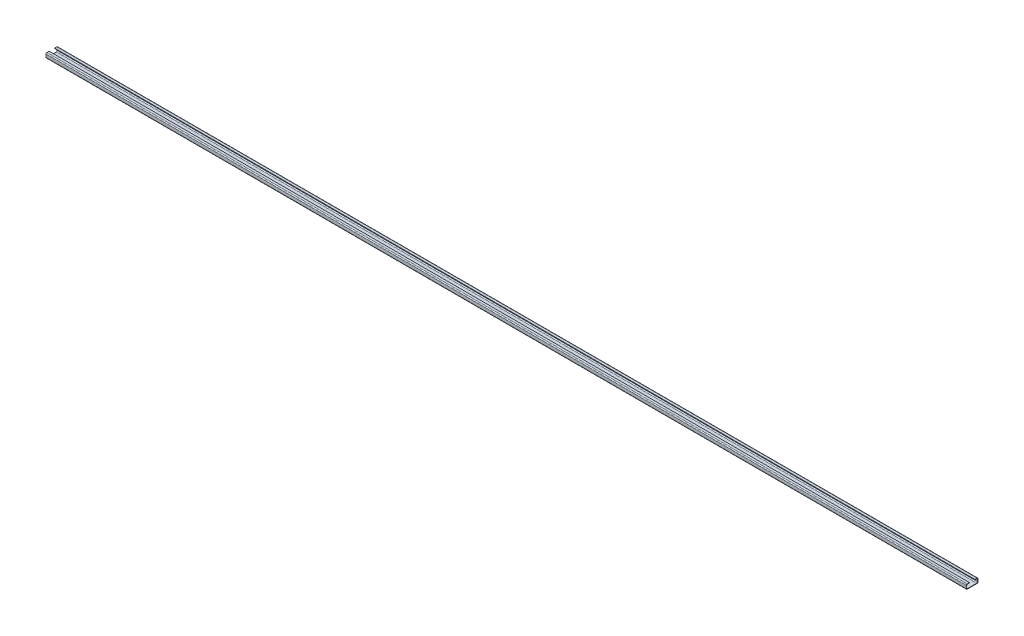
ISO-10303-21;
HEADER;
FILE_DESCRIPTION(('STEP AP214'),'2;1');
FILE_NAME('part.step','',(''),(''),'','','');
FILE_SCHEMA(('AUTOMOTIVE_DESIGN { 1 0 10303 214 1 1 1 1 }'));
ENDSEC;
DATA;
#1=APPLICATION_CONTEXT('core data for automotive mechanical design processes');
#2=APPLICATION_PROTOCOL_DEFINITION('international standard','automotive_design',2000,#1);
#3=PRODUCT_CONTEXT('',#1,'mechanical');
#4=PRODUCT('Part','Part','',(#3));
#5=PRODUCT_RELATED_PRODUCT_CATEGORY('part','',(#4));
#6=PRODUCT_DEFINITION_FORMATION('','',#4);
#7=PRODUCT_DEFINITION_CONTEXT('part definition',#1,'design');
#8=PRODUCT_DEFINITION('design','',#6,#7);
#9=PRODUCT_DEFINITION_SHAPE('','',#8);
#10=(LENGTH_UNIT() NAMED_UNIT(*) SI_UNIT(.MILLI.,.METRE.));
#11=(NAMED_UNIT(*) PLANE_ANGLE_UNIT() SI_UNIT($,.RADIAN.));
#12=(NAMED_UNIT(*) SI_UNIT($,.STERADIAN.) SOLID_ANGLE_UNIT());
#13=UNCERTAINTY_MEASURE_WITH_UNIT(LENGTH_MEASURE(1.E-05),#10,'distance_accuracy_value','');
#14=(GEOMETRIC_REPRESENTATION_CONTEXT(3) GLOBAL_UNCERTAINTY_ASSIGNED_CONTEXT((#13)) GLOBAL_UNIT_ASSIGNED_CONTEXT((#10,
#11,#12)) REPRESENTATION_CONTEXT('',''));
#15=CARTESIAN_POINT('',(0.,0.,0.));
#16=DIRECTION('',(0.,0.,1.));
#17=DIRECTION('',(1.,0.,0.));
#18=AXIS2_PLACEMENT_3D('',#15,#16,#17);
#19=CARTESIAN_POINT('',(5900.,15.,-37.5));
#20=DIRECTION('',(0.,0.,1.));
#21=DIRECTION('',(1.,0.,0.));
#22=AXIS2_PLACEMENT_3D('',#19,#20,#21);
#23=PLANE('',#22);
#24=DIRECTION('',(0.,1.,0.));
#25=VECTOR('',#24,1.);
#26=CARTESIAN_POINT('',(0.,15.,-37.5));
#27=LINE('',#26,#25);
#28=CARTESIAN_POINT('',(0.,-9.,-37.5));
#29=VERTEX_POINT('',#28);
#30=CARTESIAN_POINT('',(0.,9.,-37.5));
#31=VERTEX_POINT('',#30);
#32=EDGE_CURVE('E223',#29,#31,#27,.T.);
#33=ORIENTED_EDGE('',*,*,#32,.T.);
#34=DIRECTION('',(-1.,0.,0.));
#35=VECTOR('',#34,1.);
#36=CARTESIAN_POINT('',(5900.,9.,-37.5));
#37=LINE('',#36,#35);
#38=CARTESIAN_POINT('',(5900.,9.,-37.5));
#39=VERTEX_POINT('',#38);
#40=EDGE_CURVE('E299',#31,#39,#37,.F.);
#41=ORIENTED_EDGE('',*,*,#40,.T.);
#42=DIRECTION('',(0.,1.,0.));
#43=VECTOR('',#42,1.);
#44=CARTESIAN_POINT('',(5900.,15.,-37.5));
#45=LINE('',#44,#43);
#46=CARTESIAN_POINT('',(5900.,-9.,-37.5));
#47=VERTEX_POINT('',#46);
#48=EDGE_CURVE('E183',#47,#39,#45,.T.);
#49=ORIENTED_EDGE('',*,*,#48,.F.);
#50=DIRECTION('',(-1.,0.,0.));
#51=VECTOR('',#50,1.);
#52=CARTESIAN_POINT('',(5900.,-9.,-37.5));
#53=LINE('',#52,#51);
#54=EDGE_CURVE('E296',#47,#29,#53,.T.);
#55=ORIENTED_EDGE('',*,*,#54,.T.);
#56=EDGE_LOOP('',(#33,#41,#49,#55));
#57=FACE_BOUND('',#56,.T.);
#58=ADVANCED_FACE('F33',(#57),#23,.F.);
#59=CARTESIAN_POINT('',(5900.,15.,-17.5));
#60=DIRECTION('',(0.,-1.,0.));
#61=DIRECTION('',(0.,0.,-1.));
#62=AXIS2_PLACEMENT_3D('',#59,#60,#61);
#63=PLANE('',#62);
#64=DIRECTION('',(0.,0.,1.));
#65=VECTOR('',#64,1.);
#66=CARTESIAN_POINT('',(5900.,15.,-17.5));
#67=LINE('',#66,#65);
#68=CARTESIAN_POINT('',(5900.,15.,-31.5));
#69=VERTEX_POINT('',#68);
#70=CARTESIAN_POINT('',(5900.,15.,-17.5));
#71=VERTEX_POINT('',#70);
#72=EDGE_CURVE('E169',#69,#71,#67,.T.);
#73=ORIENTED_EDGE('',*,*,#72,.F.);
#74=DIRECTION('',(-1.,0.,0.));
#75=VECTOR('',#74,1.);
#76=CARTESIAN_POINT('',(5900.,15.,-31.5));
#77=LINE('',#76,#75);
#78=CARTESIAN_POINT('',(0.,15.,-31.5));
#79=VERTEX_POINT('',#78);
#80=EDGE_CURVE('E294',#69,#79,#77,.T.);
#81=ORIENTED_EDGE('',*,*,#80,.T.);
#82=DIRECTION('',(0.,0.,1.));
#83=VECTOR('',#82,1.);
#84=CARTESIAN_POINT('',(0.,15.,-17.5));
#85=LINE('',#84,#83);
#86=CARTESIAN_POINT('',(0.,15.,-17.5));
#87=VERTEX_POINT('',#86);
#88=EDGE_CURVE('E189',#79,#87,#85,.T.);
#89=ORIENTED_EDGE('',*,*,#88,.T.);
#90=DIRECTION('',(-1.,0.,0.));
#91=VECTOR('',#90,1.);
#92=CARTESIAN_POINT('',(5900.,15.,-17.5));
#93=LINE('',#92,#91);
#94=EDGE_CURVE('E186',#71,#87,#93,.T.);
#95=ORIENTED_EDGE('',*,*,#94,.F.);
#96=EDGE_LOOP('',(#73,#81,#89,#95));
#97=FACE_BOUND('',#96,.T.);
#98=ADVANCED_FACE('F187',(#97),#63,.F.);
#99=CARTESIAN_POINT('',(5900.,15.,-17.5));
#100=DIRECTION('',(0.,0.,-1.));
#101=DIRECTION('',(0.,1.,0.));
#102=AXIS2_PLACEMENT_3D('',#99,#100,#101);
#103=PLANE('',#102);
#104=DIRECTION('',(0.,-1.,0.));
#105=VECTOR('',#104,1.);
#106=CARTESIAN_POINT('',(0.,15.,-17.5));
#107=LINE('',#106,#105);
#108=CARTESIAN_POINT('',(0.,12.25,-17.5));
#109=VERTEX_POINT('',#108);
#110=EDGE_CURVE('E227',#87,#109,#107,.T.);
#111=ORIENTED_EDGE('',*,*,#110,.T.);
#112=DIRECTION('',(-1.,0.,0.));
#113=VECTOR('',#112,1.);
#114=CARTESIAN_POINT('',(5900.,12.25,-17.5));
#115=LINE('',#114,#113);
#116=CARTESIAN_POINT('',(5900.,12.25,-17.5));
#117=VERTEX_POINT('',#116);
#118=EDGE_CURVE('E193',#117,#109,#115,.T.);
#119=ORIENTED_EDGE('',*,*,#118,.F.);
#120=DIRECTION('',(0.,-1.,0.));
#121=VECTOR('',#120,1.);
#122=CARTESIAN_POINT('',(5900.,15.,-17.5));
#123=LINE('',#122,#121);
#124=EDGE_CURVE('E175',#71,#117,#123,.T.);
#125=ORIENTED_EDGE('',*,*,#124,.F.);
#126=ORIENTED_EDGE('',*,*,#94,.T.);
#127=EDGE_LOOP('',(#111,#119,#125,#126));
#128=FACE_BOUND('',#127,.T.);
#129=ADVANCED_FACE('F195',(#128),#103,.F.);
#130=CARTESIAN_POINT('',(5900.,12.25,-17.5));
#131=DIRECTION('',(0.,1.,0.));
#132=DIRECTION('',(0.,0.,1.));
#133=AXIS2_PLACEMENT_3D('',#130,#131,#132);
#134=PLANE('',#133);
#135=DIRECTION('',(0.,0.,-1.));
#136=VECTOR('',#135,1.);
#137=CARTESIAN_POINT('',(0.,12.25,-17.5));
#138=LINE('',#137,#136);
#139=CARTESIAN_POINT('',(0.,12.25,-28.75));
#140=VERTEX_POINT('',#139);
#141=EDGE_CURVE('E229',#109,#140,#138,.T.);
#142=ORIENTED_EDGE('',*,*,#141,.T.);
#143=DIRECTION('',(-1.,0.,0.));
#144=VECTOR('',#143,1.);
#145=CARTESIAN_POINT('',(5900.,12.25,-28.75));
#146=LINE('',#145,#144);
#147=CARTESIAN_POINT('',(5900.,12.25,-28.75));
#148=VERTEX_POINT('',#147);
#149=EDGE_CURVE('E263',#140,#148,#146,.F.);
#150=ORIENTED_EDGE('',*,*,#149,.T.);
#151=DIRECTION('',(0.,0.,-1.));
#152=VECTOR('',#151,1.);
#153=CARTESIAN_POINT('',(5900.,12.25,-17.5));
#154=LINE('',#153,#152);
#155=EDGE_CURVE('E198',#117,#148,#154,.T.);
#156=ORIENTED_EDGE('',*,*,#155,.F.);
#157=ORIENTED_EDGE('',*,*,#118,.T.);
#158=EDGE_LOOP('',(#142,#150,#156,#157));
#159=FACE_BOUND('',#158,.T.);
#160=ADVANCED_FACE('F458',(#159),#134,.F.);
#161=CARTESIAN_POINT('',(5900.,12.25,-34.75));
#162=DIRECTION('',(0.,0.,-1.));
#163=DIRECTION('',(0.,1.,0.));
#164=AXIS2_PLACEMENT_3D('',#161,#162,#163);
#165=PLANE('',#164);
#166=DIRECTION('',(0.,-1.,0.));
#167=VECTOR('',#166,1.);
#168=CARTESIAN_POINT('',(5900.,12.25,-34.75));
#169=LINE('',#168,#167);
#170=CARTESIAN_POINT('',(5900.,6.25,-34.75));
#171=VERTEX_POINT('',#170);
#172=CARTESIAN_POINT('',(5900.,-6.25,-34.75));
#173=VERTEX_POINT('',#172);
#174=EDGE_CURVE('E200',#171,#173,#169,.T.);
#175=ORIENTED_EDGE('',*,*,#174,.F.);
#176=DIRECTION('',(-1.,0.,0.));
#177=VECTOR('',#176,1.);
#178=CARTESIAN_POINT('',(0.,6.25,-34.75));
#179=LINE('',#178,#177);
#180=CARTESIAN_POINT('',(0.,6.25,-34.75));
#181=VERTEX_POINT('',#180);
#182=EDGE_CURVE('E260',#171,#181,#179,.T.);
#183=ORIENTED_EDGE('',*,*,#182,.T.);
#184=DIRECTION('',(0.,-1.,0.));
#185=VECTOR('',#184,1.);
#186=CARTESIAN_POINT('',(0.,12.25,-34.75));
#187=LINE('',#186,#185);
#188=CARTESIAN_POINT('',(0.,-6.25,-34.75));
#189=VERTEX_POINT('',#188);
#190=EDGE_CURVE('E232',#181,#189,#187,.T.);
#191=ORIENTED_EDGE('',*,*,#190,.T.);
#192=DIRECTION('',(-1.,0.,0.));
#193=VECTOR('',#192,1.);
#194=CARTESIAN_POINT('',(5900.,-6.25,-34.75));
#195=LINE('',#194,#193);
#196=EDGE_CURVE('E192',#189,#173,#195,.F.);
#197=ORIENTED_EDGE('',*,*,#196,.T.);
#198=EDGE_LOOP('',(#175,#183,#191,#197));
#199=FACE_BOUND('',#198,.T.);
#200=ADVANCED_FACE('F453',(#199),#165,.F.);
#201=CARTESIAN_POINT('',(5900.,-12.25,34.75));
#202=DIRECTION('',(0.,-1.,0.));
#203=DIRECTION('',(0.,0.,-1.));
#204=AXIS2_PLACEMENT_3D('',#201,#202,#203);
#205=PLANE('',#204);
#206=DIRECTION('',(0.,0.,1.));
#207=VECTOR('',#206,1.);
#208=CARTESIAN_POINT('',(5900.,-12.25,34.75));
#209=LINE('',#208,#207);
#210=CARTESIAN_POINT('',(5900.,-12.25,-28.75));
#211=VERTEX_POINT('',#210);
#212=CARTESIAN_POINT('',(5900.,-12.25,28.75));
#213=VERTEX_POINT('',#212);
#214=EDGE_CURVE('E206',#211,#213,#209,.T.);
#215=ORIENTED_EDGE('',*,*,#214,.F.);
#216=DIRECTION('',(-1.,0.,0.));
#217=VECTOR('',#216,1.);
#218=CARTESIAN_POINT('',(0.,-12.25,-28.75));
#219=LINE('',#218,#217);
#220=CARTESIAN_POINT('',(0.,-12.25,-28.75));
#221=VERTEX_POINT('',#220);
#222=EDGE_CURVE('E307',#211,#221,#219,.T.);
#223=ORIENTED_EDGE('',*,*,#222,.T.);
#224=DIRECTION('',(0.,0.,1.));
#225=VECTOR('',#224,1.);
#226=CARTESIAN_POINT('',(0.,-12.25,34.75));
#227=LINE('',#226,#225);
#228=CARTESIAN_POINT('',(0.,-12.25,28.75));
#229=VERTEX_POINT('',#228);
#230=EDGE_CURVE('E235',#221,#229,#227,.T.);
#231=ORIENTED_EDGE('',*,*,#230,.T.);
#232=DIRECTION('',(-1.,0.,0.));
#233=VECTOR('',#232,1.);
#234=CARTESIAN_POINT('',(5900.,-12.25,28.75));
#235=LINE('',#234,#233);
#236=EDGE_CURVE('E305',#229,#213,#235,.F.);
#237=ORIENTED_EDGE('',*,*,#236,.T.);
#238=EDGE_LOOP('',(#215,#223,#231,#237));
#239=FACE_BOUND('',#238,.T.);
#240=ADVANCED_FACE('F331',(#239),#205,.F.);
#241=CARTESIAN_POINT('',(5900.,12.25,34.75));
#242=DIRECTION('',(0.,0.,1.));
#243=DIRECTION('',(1.,0.,0.));
#244=AXIS2_PLACEMENT_3D('',#241,#242,#243);
#245=PLANE('',#244);
#246=DIRECTION('',(0.,1.,0.));
#247=VECTOR('',#246,1.);
#248=CARTESIAN_POINT('',(0.,12.25,34.75));
#249=LINE('',#248,#247);
#250=CARTESIAN_POINT('',(0.,-6.25,34.75));
#251=VERTEX_POINT('',#250);
#252=CARTESIAN_POINT('',(0.,6.25,34.75));
#253=VERTEX_POINT('',#252);
#254=EDGE_CURVE('E238',#251,#253,#249,.T.);
#255=ORIENTED_EDGE('',*,*,#254,.T.);
#256=DIRECTION('',(-1.,0.,0.));
#257=VECTOR('',#256,1.);
#258=CARTESIAN_POINT('',(5900.,6.25,34.75));
#259=LINE('',#258,#257);
#260=CARTESIAN_POINT('',(5900.,6.25,34.75));
#261=VERTEX_POINT('',#260);
#262=EDGE_CURVE('E271',#253,#261,#259,.F.);
#263=ORIENTED_EDGE('',*,*,#262,.T.);
#264=DIRECTION('',(0.,1.,0.));
#265=VECTOR('',#264,1.);
#266=CARTESIAN_POINT('',(5900.,12.25,34.75));
#267=LINE('',#266,#265);
#268=CARTESIAN_POINT('',(5900.,-6.25,34.75));
#269=VERTEX_POINT('',#268);
#270=EDGE_CURVE('E209',#269,#261,#267,.T.);
#271=ORIENTED_EDGE('',*,*,#270,.F.);
#272=DIRECTION('',(-1.,0.,0.));
#273=VECTOR('',#272,1.);
#274=CARTESIAN_POINT('',(0.,-6.25,34.75));
#275=LINE('',#274,#273);
#276=EDGE_CURVE('E268',#269,#251,#275,.T.);
#277=ORIENTED_EDGE('',*,*,#276,.T.);
#278=EDGE_LOOP('',(#255,#263,#271,#277));
#279=FACE_BOUND('',#278,.T.);
#280=ADVANCED_FACE('F338',(#279),#245,.F.);
#281=CARTESIAN_POINT('',(5900.,12.25,34.75));
#282=DIRECTION('',(0.,1.,0.));
#283=DIRECTION('',(0.,0.,1.));
#284=AXIS2_PLACEMENT_3D('',#281,#282,#283);
#285=PLANE('',#284);
#286=DIRECTION('',(0.,0.,-1.));
#287=VECTOR('',#286,1.);
#288=CARTESIAN_POINT('',(5900.,12.25,34.75));
#289=LINE('',#288,#287);
#290=CARTESIAN_POINT('',(5900.,12.25,28.75));
#291=VERTEX_POINT('',#290);
#292=CARTESIAN_POINT('',(5900.,12.25,17.5));
#293=VERTEX_POINT('',#292);
#294=EDGE_CURVE('E212',#291,#293,#289,.T.);
#295=ORIENTED_EDGE('',*,*,#294,.F.);
#296=DIRECTION('',(-1.,0.,0.));
#297=VECTOR('',#296,1.);
#298=CARTESIAN_POINT('',(0.,12.25,28.75));
#299=LINE('',#298,#297);
#300=CARTESIAN_POINT('',(0.,12.25,28.75));
#301=VERTEX_POINT('',#300);
#302=EDGE_CURVE('E265',#291,#301,#299,.T.);
#303=ORIENTED_EDGE('',*,*,#302,.T.);
#304=DIRECTION('',(0.,0.,-1.));
#305=VECTOR('',#304,1.);
#306=CARTESIAN_POINT('',(0.,12.25,34.75));
#307=LINE('',#306,#305);
#308=CARTESIAN_POINT('',(0.,12.25,17.5));
#309=VERTEX_POINT('',#308);
#310=EDGE_CURVE('E241',#301,#309,#307,.T.);
#311=ORIENTED_EDGE('',*,*,#310,.T.);
#312=DIRECTION('',(-1.,0.,0.));
#313=VECTOR('',#312,1.);
#314=CARTESIAN_POINT('',(5900.,12.25,17.5));
#315=LINE('',#314,#313);
#316=EDGE_CURVE('E255',#293,#309,#315,.T.);
#317=ORIENTED_EDGE('',*,*,#316,.F.);
#318=EDGE_LOOP('',(#295,#303,#311,#317));
#319=FACE_BOUND('',#318,.T.);
#320=ADVANCED_FACE('F346',(#319),#285,.F.);
#321=CARTESIAN_POINT('',(5900.,15.,17.5));
#322=DIRECTION('',(0.,0.,1.));
#323=DIRECTION('',(1.,0.,0.));
#324=AXIS2_PLACEMENT_3D('',#321,#322,#323);
#325=PLANE('',#324);
#326=DIRECTION('',(0.,1.,0.));
#327=VECTOR('',#326,1.);
#328=CARTESIAN_POINT('',(0.,15.,17.5));
#329=LINE('',#328,#327);
#330=CARTESIAN_POINT('',(0.,15.,17.5));
#331=VERTEX_POINT('',#330);
#332=EDGE_CURVE('E243',#309,#331,#329,.T.);
#333=ORIENTED_EDGE('',*,*,#332,.T.);
#334=DIRECTION('',(-1.,0.,0.));
#335=VECTOR('',#334,1.);
#336=CARTESIAN_POINT('',(5900.,15.,17.5));
#337=LINE('',#336,#335);
#338=CARTESIAN_POINT('',(5900.,15.,17.5));
#339=VERTEX_POINT('',#338);
#340=EDGE_CURVE('E222',#339,#331,#337,.T.);
#341=ORIENTED_EDGE('',*,*,#340,.F.);
#342=DIRECTION('',(0.,1.,0.));
#343=VECTOR('',#342,1.);
#344=CARTESIAN_POINT('',(5900.,15.,17.5));
#345=LINE('',#344,#343);
#346=EDGE_CURVE('E214',#293,#339,#345,.T.);
#347=ORIENTED_EDGE('',*,*,#346,.F.);
#348=ORIENTED_EDGE('',*,*,#316,.T.);
#349=EDGE_LOOP('',(#333,#341,#347,#348));
#350=FACE_BOUND('',#349,.T.);
#351=ADVANCED_FACE('F352',(#350),#325,.F.);
#352=CARTESIAN_POINT('',(5900.,15.,37.5));
#353=DIRECTION('',(0.,-1.,0.));
#354=DIRECTION('',(0.,0.,-1.));
#355=AXIS2_PLACEMENT_3D('',#352,#353,#354);
#356=PLANE('',#355);
#357=DIRECTION('',(0.,0.,1.));
#358=VECTOR('',#357,1.);
#359=CARTESIAN_POINT('',(0.,15.,37.5));
#360=LINE('',#359,#358);
#361=CARTESIAN_POINT('',(0.,15.,31.5));
#362=VERTEX_POINT('',#361);
#363=EDGE_CURVE('E245',#331,#362,#360,.T.);
#364=ORIENTED_EDGE('',*,*,#363,.T.);
#365=DIRECTION('',(-1.,0.,0.));
#366=VECTOR('',#365,1.);
#367=CARTESIAN_POINT('',(5900.,15.,31.5));
#368=LINE('',#367,#366);
#369=CARTESIAN_POINT('',(5900.,15.,31.5));
#370=VERTEX_POINT('',#369);
#371=EDGE_CURVE('E286',#362,#370,#368,.F.);
#372=ORIENTED_EDGE('',*,*,#371,.T.);
#373=DIRECTION('',(0.,0.,1.));
#374=VECTOR('',#373,1.);
#375=CARTESIAN_POINT('',(5900.,15.,37.5));
#376=LINE('',#375,#374);
#377=EDGE_CURVE('E216',#339,#370,#376,.T.);
#378=ORIENTED_EDGE('',*,*,#377,.F.);
#379=ORIENTED_EDGE('',*,*,#340,.T.);
#380=EDGE_LOOP('',(#364,#372,#378,#379));
#381=FACE_BOUND('',#380,.T.);
#382=ADVANCED_FACE('F475',(#381),#356,.F.);
#383=CARTESIAN_POINT('',(5900.,15.,37.5));
#384=DIRECTION('',(0.,0.,-1.));
#385=DIRECTION('',(0.,1.,0.));
#386=AXIS2_PLACEMENT_3D('',#383,#384,#385);
#387=PLANE('',#386);
#388=DIRECTION('',(0.,-1.,0.));
#389=VECTOR('',#388,1.);
#390=CARTESIAN_POINT('',(5900.,15.,37.5));
#391=LINE('',#390,#389);
#392=CARTESIAN_POINT('',(5900.,9.,37.5));
#393=VERTEX_POINT('',#392);
#394=CARTESIAN_POINT('',(5900.,-9.,37.5));
#395=VERTEX_POINT('',#394);
#396=EDGE_CURVE('E218',#393,#395,#391,.T.);
#397=ORIENTED_EDGE('',*,*,#396,.F.);
#398=DIRECTION('',(-1.,0.,0.));
#399=VECTOR('',#398,1.);
#400=CARTESIAN_POINT('',(5900.,9.,37.5));
#401=LINE('',#400,#399);
#402=CARTESIAN_POINT('',(0.,9.,37.5));
#403=VERTEX_POINT('',#402);
#404=EDGE_CURVE('E275',#393,#403,#401,.T.);
#405=ORIENTED_EDGE('',*,*,#404,.T.);
#406=DIRECTION('',(0.,-1.,0.));
#407=VECTOR('',#406,1.);
#408=CARTESIAN_POINT('',(0.,15.,37.5));
#409=LINE('',#408,#407);
#410=CARTESIAN_POINT('',(0.,-9.,37.5));
#411=VERTEX_POINT('',#410);
#412=EDGE_CURVE('E248',#403,#411,#409,.T.);
#413=ORIENTED_EDGE('',*,*,#412,.T.);
#414=DIRECTION('',(-1.,0.,0.));
#415=VECTOR('',#414,1.);
#416=CARTESIAN_POINT('',(5900.,-9.,37.5));
#417=LINE('',#416,#415);
#418=EDGE_CURVE('E273',#411,#395,#417,.F.);
#419=ORIENTED_EDGE('',*,*,#418,.T.);
#420=EDGE_LOOP('',(#397,#405,#413,#419));
#421=FACE_BOUND('',#420,.T.);
#422=ADVANCED_FACE('F362',(#421),#387,.F.);
#423=CARTESIAN_POINT('',(5900.,-15.,37.5));
#424=DIRECTION('',(0.,1.,0.));
#425=DIRECTION('',(0.,0.,1.));
#426=AXIS2_PLACEMENT_3D('',#423,#424,#425);
#427=PLANE('',#426);
#428=DIRECTION('',(0.,0.,-1.));
#429=VECTOR('',#428,1.);
#430=CARTESIAN_POINT('',(0.,-15.,37.5));
#431=LINE('',#430,#429);
#432=CARTESIAN_POINT('',(0.,-15.,31.5));
#433=VERTEX_POINT('',#432);
#434=CARTESIAN_POINT('',(0.,-15.,-31.5));
#435=VERTEX_POINT('',#434);
#436=EDGE_CURVE('E251',#433,#435,#431,.T.);
#437=ORIENTED_EDGE('',*,*,#436,.T.);
#438=DIRECTION('',(-1.,0.,0.));
#439=VECTOR('',#438,1.);
#440=CARTESIAN_POINT('',(5900.,-15.,-31.5));
#441=LINE('',#440,#439);
#442=CARTESIAN_POINT('',(5900.,-15.,-31.5));
#443=VERTEX_POINT('',#442);
#444=EDGE_CURVE('E48',#435,#443,#441,.F.);
#445=ORIENTED_EDGE('',*,*,#444,.T.);
#446=DIRECTION('',(0.,0.,-1.));
#447=VECTOR('',#446,1.);
#448=CARTESIAN_POINT('',(5900.,-15.,37.5));
#449=LINE('',#448,#447);
#450=CARTESIAN_POINT('',(5900.,-15.,31.5));
#451=VERTEX_POINT('',#450);
#452=EDGE_CURVE('E220',#451,#443,#449,.T.);
#453=ORIENTED_EDGE('',*,*,#452,.F.);
#454=DIRECTION('',(-1.,0.,0.));
#455=VECTOR('',#454,1.);
#456=CARTESIAN_POINT('',(5900.,-15.,31.5));
#457=LINE('',#456,#455);
#458=EDGE_CURVE('E301',#451,#433,#457,.T.);
#459=ORIENTED_EDGE('',*,*,#458,.T.);
#460=EDGE_LOOP('',(#437,#445,#453,#459));
#461=FACE_BOUND('',#460,.T.);
#462=ADVANCED_FACE('F368',(#461),#427,.F.);
#463=CARTESIAN_POINT('',(5900.,0.,0.));
#464=DIRECTION('',(1.,0.,0.));
#465=DIRECTION('',(0.,0.,-1.));
#466=AXIS2_PLACEMENT_3D('',#463,#464,#465);
#467=PLANE('',#466);
#468=ORIENTED_EDGE('',*,*,#377,.T.);
#469=CARTESIAN_POINT('',(5900.,9.,31.5));
#470=DIRECTION('',(1.,0.,0.));
#471=DIRECTION('',(0.,0.,-1.));
#472=AXIS2_PLACEMENT_3D('',#469,#470,#471);
#473=CIRCLE('',#472,6.);
#474=EDGE_CURVE('E292',#370,#393,#473,.T.);
#475=ORIENTED_EDGE('',*,*,#474,.T.);
#476=ORIENTED_EDGE('',*,*,#396,.T.);
#477=CARTESIAN_POINT('',(5900.,-9.,31.5));
#478=DIRECTION('',(1.,0.,0.));
#479=DIRECTION('',(0.,0.,-1.));
#480=AXIS2_PLACEMENT_3D('',#477,#478,#479);
#481=CIRCLE('',#480,6.);
#482=EDGE_CURVE('E55',#395,#451,#481,.T.);
#483=ORIENTED_EDGE('',*,*,#482,.T.);
#484=ORIENTED_EDGE('',*,*,#452,.T.);
#485=CARTESIAN_POINT('',(5900.,-9.,-31.5));
#486=DIRECTION('',(1.,0.,0.));
#487=DIRECTION('',(0.,0.,-1.));
#488=AXIS2_PLACEMENT_3D('',#485,#486,#487);
#489=CIRCLE('',#488,6.);
#490=EDGE_CURVE('E289',#443,#47,#489,.T.);
#491=ORIENTED_EDGE('',*,*,#490,.T.);
#492=ORIENTED_EDGE('',*,*,#48,.T.);
#493=CARTESIAN_POINT('',(5900.,9.,-31.5));
#494=DIRECTION('',(1.,0.,0.));
#495=DIRECTION('',(0.,0.,-1.));
#496=AXIS2_PLACEMENT_3D('',#493,#494,#495);
#497=CIRCLE('',#496,6.);
#498=EDGE_CURVE('E179',#39,#69,#497,.T.);
#499=ORIENTED_EDGE('',*,*,#498,.T.);
#500=ORIENTED_EDGE('',*,*,#72,.T.);
#501=ORIENTED_EDGE('',*,*,#124,.T.);
#502=ORIENTED_EDGE('',*,*,#155,.T.);
#503=CARTESIAN_POINT('',(5900.,6.25,-28.75));
#504=DIRECTION('',(1.,0.,0.));
#505=DIRECTION('',(0.,0.,-1.));
#506=AXIS2_PLACEMENT_3D('',#503,#504,#505);
#507=CIRCLE('',#506,6.);
#508=EDGE_CURVE('E312',#148,#171,#507,.F.);
#509=ORIENTED_EDGE('',*,*,#508,.T.);
#510=ORIENTED_EDGE('',*,*,#174,.T.);
#511=CARTESIAN_POINT('',(5900.,-6.25,-28.75));
#512=DIRECTION('',(1.,0.,0.));
#513=DIRECTION('',(0.,0.,-1.));
#514=AXIS2_PLACEMENT_3D('',#511,#512,#513);
#515=CIRCLE('',#514,6.);
#516=EDGE_CURVE('E320',#173,#211,#515,.F.);
#517=ORIENTED_EDGE('',*,*,#516,.T.);
#518=ORIENTED_EDGE('',*,*,#214,.T.);
#519=CARTESIAN_POINT('',(5900.,-6.25,28.75));
#520=DIRECTION('',(1.,0.,0.));
#521=DIRECTION('',(0.,0.,-1.));
#522=AXIS2_PLACEMENT_3D('',#519,#520,#521);
#523=CIRCLE('',#522,6.);
#524=EDGE_CURVE('E11',#213,#269,#523,.F.);
#525=ORIENTED_EDGE('',*,*,#524,.T.);
#526=ORIENTED_EDGE('',*,*,#270,.T.);
#527=CARTESIAN_POINT('',(5900.,6.25,28.75));
#528=DIRECTION('',(1.,0.,0.));
#529=DIRECTION('',(0.,0.,-1.));
#530=AXIS2_PLACEMENT_3D('',#527,#528,#529);
#531=CIRCLE('',#530,6.);
#532=EDGE_CURVE('E316',#261,#291,#531,.F.);
#533=ORIENTED_EDGE('',*,*,#532,.T.);
#534=ORIENTED_EDGE('',*,*,#294,.T.);
#535=ORIENTED_EDGE('',*,*,#346,.T.);
#536=EDGE_LOOP('',(#468,#475,#476,#483,#484,#491,#492,#499,#500,#501,#502,#509,#510,#517,#518,
#525,#526,#533,#534,#535));
#537=FACE_BOUND('',#536,.T.);
#538=ADVANCED_FACE('F172',(#537),#467,.T.);
#539=CARTESIAN_POINT('',(0.,0.,0.));
#540=DIRECTION('',(1.,0.,0.));
#541=DIRECTION('',(0.,0.,-1.));
#542=AXIS2_PLACEMENT_3D('',#539,#540,#541);
#543=PLANE('',#542);
#544=ORIENTED_EDGE('',*,*,#412,.F.);
#545=CARTESIAN_POINT('',(0.,9.,31.5));
#546=DIRECTION('',(1.,0.,0.));
#547=DIRECTION('',(0.,0.,-1.));
#548=AXIS2_PLACEMENT_3D('',#545,#546,#547);
#549=CIRCLE('',#548,6.);
#550=EDGE_CURVE('E284',#403,#362,#549,.F.);
#551=ORIENTED_EDGE('',*,*,#550,.T.);
#552=ORIENTED_EDGE('',*,*,#363,.F.);
#553=ORIENTED_EDGE('',*,*,#332,.F.);
#554=ORIENTED_EDGE('',*,*,#310,.F.);
#555=CARTESIAN_POINT('',(0.,6.25,28.75));
#556=DIRECTION('',(1.,0.,0.));
#557=DIRECTION('',(0.,0.,-1.));
#558=AXIS2_PLACEMENT_3D('',#555,#556,#557);
#559=CIRCLE('',#558,6.);
#560=EDGE_CURVE('E314',#301,#253,#559,.T.);
#561=ORIENTED_EDGE('',*,*,#560,.T.);
#562=ORIENTED_EDGE('',*,*,#254,.F.);
#563=CARTESIAN_POINT('',(0.,-6.25,28.75));
#564=DIRECTION('',(1.,0.,0.));
#565=DIRECTION('',(0.,0.,-1.));
#566=AXIS2_PLACEMENT_3D('',#563,#564,#565);
#567=CIRCLE('',#566,6.);
#568=EDGE_CURVE('E41',#251,#229,#567,.T.);
#569=ORIENTED_EDGE('',*,*,#568,.T.);
#570=ORIENTED_EDGE('',*,*,#230,.F.);
#571=CARTESIAN_POINT('',(0.,-6.25,-28.75));
#572=DIRECTION('',(1.,0.,0.));
#573=DIRECTION('',(0.,0.,-1.));
#574=AXIS2_PLACEMENT_3D('',#571,#572,#573);
#575=CIRCLE('',#574,6.);
#576=EDGE_CURVE('E318',#221,#189,#575,.T.);
#577=ORIENTED_EDGE('',*,*,#576,.T.);
#578=ORIENTED_EDGE('',*,*,#190,.F.);
#579=CARTESIAN_POINT('',(0.,6.25,-28.75));
#580=DIRECTION('',(1.,0.,0.));
#581=DIRECTION('',(0.,0.,-1.));
#582=AXIS2_PLACEMENT_3D('',#579,#580,#581);
#583=CIRCLE('',#582,6.);
#584=EDGE_CURVE('E310',#181,#140,#583,.T.);
#585=ORIENTED_EDGE('',*,*,#584,.T.);
#586=ORIENTED_EDGE('',*,*,#141,.F.);
#587=ORIENTED_EDGE('',*,*,#110,.F.);
#588=ORIENTED_EDGE('',*,*,#88,.F.);
#589=CARTESIAN_POINT('',(0.,9.,-31.5));
#590=DIRECTION('',(1.,0.,0.));
#591=DIRECTION('',(0.,0.,-1.));
#592=AXIS2_PLACEMENT_3D('',#589,#590,#591);
#593=CIRCLE('',#592,6.);
#594=EDGE_CURVE('E282',#79,#31,#593,.F.);
#595=ORIENTED_EDGE('',*,*,#594,.T.);
#596=ORIENTED_EDGE('',*,*,#32,.F.);
#597=CARTESIAN_POINT('',(0.,-9.,-31.5));
#598=DIRECTION('',(1.,0.,0.));
#599=DIRECTION('',(0.,0.,-1.));
#600=AXIS2_PLACEMENT_3D('',#597,#598,#599);
#601=CIRCLE('',#600,6.);
#602=EDGE_CURVE('E280',#29,#435,#601,.F.);
#603=ORIENTED_EDGE('',*,*,#602,.T.);
#604=ORIENTED_EDGE('',*,*,#436,.F.);
#605=CARTESIAN_POINT('',(0.,-9.,31.5));
#606=DIRECTION('',(1.,0.,0.));
#607=DIRECTION('',(0.,0.,-1.));
#608=AXIS2_PLACEMENT_3D('',#605,#606,#607);
#609=CIRCLE('',#608,6.);
#610=EDGE_CURVE('E278',#433,#411,#609,.F.);
#611=ORIENTED_EDGE('',*,*,#610,.T.);
#612=EDGE_LOOP('',(#544,#551,#552,#553,#554,#561,#562,#569,#570,#577,#578,#585,#586,#587,#588,
#595,#596,#603,#604,#611));
#613=FACE_BOUND('',#612,.T.);
#614=ADVANCED_FACE('F325',(#613),#543,.F.);
#615=CARTESIAN_POINT('',(5900.,6.25,-28.75));
#616=DIRECTION('',(1.,0.,0.));
#617=DIRECTION('',(0.,0.,-1.));
#618=AXIS2_PLACEMENT_3D('',#615,#616,#617);
#619=CYLINDRICAL_SURFACE('',#618,6.);
#620=ORIENTED_EDGE('',*,*,#508,.F.);
#621=ORIENTED_EDGE('',*,*,#149,.F.);
#622=ORIENTED_EDGE('',*,*,#584,.F.);
#623=ORIENTED_EDGE('',*,*,#182,.F.);
#624=EDGE_LOOP('',(#620,#621,#622,#623));
#625=FACE_BOUND('',#624,.T.);
#626=ADVANCED_FACE('F396',(#625),#619,.F.);
#627=CARTESIAN_POINT('',(5900.,6.25,28.75));
#628=DIRECTION('',(1.,0.,0.));
#629=DIRECTION('',(0.,0.,-1.));
#630=AXIS2_PLACEMENT_3D('',#627,#628,#629);
#631=CYLINDRICAL_SURFACE('',#630,6.);
#632=ORIENTED_EDGE('',*,*,#532,.F.);
#633=ORIENTED_EDGE('',*,*,#262,.F.);
#634=ORIENTED_EDGE('',*,*,#560,.F.);
#635=ORIENTED_EDGE('',*,*,#302,.F.);
#636=EDGE_LOOP('',(#632,#633,#634,#635));
#637=FACE_BOUND('',#636,.T.);
#638=ADVANCED_FACE('F341',(#637),#631,.F.);
#639=CARTESIAN_POINT('',(5900.,9.,31.5));
#640=DIRECTION('',(-1.,0.,0.));
#641=DIRECTION('',(0.,0.,1.));
#642=AXIS2_PLACEMENT_3D('',#639,#640,#641);
#643=CYLINDRICAL_SURFACE('',#642,6.);
#644=ORIENTED_EDGE('',*,*,#474,.F.);
#645=ORIENTED_EDGE('',*,*,#371,.F.);
#646=ORIENTED_EDGE('',*,*,#550,.F.);
#647=ORIENTED_EDGE('',*,*,#404,.F.);
#648=EDGE_LOOP('',(#644,#645,#646,#647));
#649=FACE_BOUND('',#648,.T.);
#650=ADVANCED_FACE('F360',(#649),#643,.T.);
#651=CARTESIAN_POINT('',(5900.,9.,-31.5));
#652=DIRECTION('',(-1.,0.,0.));
#653=DIRECTION('',(0.,0.,1.));
#654=AXIS2_PLACEMENT_3D('',#651,#652,#653);
#655=CYLINDRICAL_SURFACE('',#654,6.);
#656=ORIENTED_EDGE('',*,*,#498,.F.);
#657=ORIENTED_EDGE('',*,*,#40,.F.);
#658=ORIENTED_EDGE('',*,*,#594,.F.);
#659=ORIENTED_EDGE('',*,*,#80,.F.);
#660=EDGE_LOOP('',(#656,#657,#658,#659));
#661=FACE_BOUND('',#660,.T.);
#662=ADVANCED_FACE('F378',(#661),#655,.T.);
#663=CARTESIAN_POINT('',(5900.,-9.,-31.5));
#664=DIRECTION('',(-1.,0.,0.));
#665=DIRECTION('',(0.,0.,1.));
#666=AXIS2_PLACEMENT_3D('',#663,#664,#665);
#667=CYLINDRICAL_SURFACE('',#666,6.);
#668=ORIENTED_EDGE('',*,*,#490,.F.);
#669=ORIENTED_EDGE('',*,*,#444,.F.);
#670=ORIENTED_EDGE('',*,*,#602,.F.);
#671=ORIENTED_EDGE('',*,*,#54,.F.);
#672=EDGE_LOOP('',(#668,#669,#670,#671));
#673=FACE_BOUND('',#672,.T.);
#674=ADVANCED_FACE('F373',(#673),#667,.T.);
#675=CARTESIAN_POINT('',(5900.,-6.25,-28.75));
#676=DIRECTION('',(1.,0.,0.));
#677=DIRECTION('',(0.,0.,-1.));
#678=AXIS2_PLACEMENT_3D('',#675,#676,#677);
#679=CYLINDRICAL_SURFACE('',#678,6.);
#680=ORIENTED_EDGE('',*,*,#516,.F.);
#681=ORIENTED_EDGE('',*,*,#196,.F.);
#682=ORIENTED_EDGE('',*,*,#576,.F.);
#683=ORIENTED_EDGE('',*,*,#222,.F.);
#684=EDGE_LOOP('',(#680,#681,#682,#683));
#685=FACE_BOUND('',#684,.T.);
#686=ADVANCED_FACE('F385',(#685),#679,.F.);
#687=CARTESIAN_POINT('',(5900.,-6.25,28.75));
#688=DIRECTION('',(1.,0.,0.));
#689=DIRECTION('',(0.,0.,-1.));
#690=AXIS2_PLACEMENT_3D('',#687,#688,#689);
#691=CYLINDRICAL_SURFACE('',#690,6.);
#692=ORIENTED_EDGE('',*,*,#524,.F.);
#693=ORIENTED_EDGE('',*,*,#236,.F.);
#694=ORIENTED_EDGE('',*,*,#568,.F.);
#695=ORIENTED_EDGE('',*,*,#276,.F.);
#696=EDGE_LOOP('',(#692,#693,#694,#695));
#697=FACE_BOUND('',#696,.T.);
#698=ADVANCED_FACE('F334',(#697),#691,.F.);
#699=CARTESIAN_POINT('',(5900.,-9.,31.5));
#700=DIRECTION('',(-1.,0.,0.));
#701=DIRECTION('',(0.,0.,1.));
#702=AXIS2_PLACEMENT_3D('',#699,#700,#701);
#703=CYLINDRICAL_SURFACE('',#702,6.);
#704=ORIENTED_EDGE('',*,*,#482,.F.);
#705=ORIENTED_EDGE('',*,*,#418,.F.);
#706=ORIENTED_EDGE('',*,*,#610,.F.);
#707=ORIENTED_EDGE('',*,*,#458,.F.);
#708=EDGE_LOOP('',(#704,#705,#706,#707));
#709=FACE_BOUND('',#708,.T.);
#710=ADVANCED_FACE('F35',(#709),#703,.T.);
#711=CLOSED_SHELL('',(#58,#98,#129,#160,#200,#240,#280,#320,#351,#382,#422,#462,#538,#614,#626,
#638,#650,#662,#674,#686,#698,#710));
#712=MANIFOLD_SOLID_BREP('B2',#711);
#713=ADVANCED_BREP_SHAPE_REPRESENTATION('',(#18,#712),#14);
#714=SHAPE_DEFINITION_REPRESENTATION(#9,#713);
ENDSEC;
END-ISO-10303-21;
